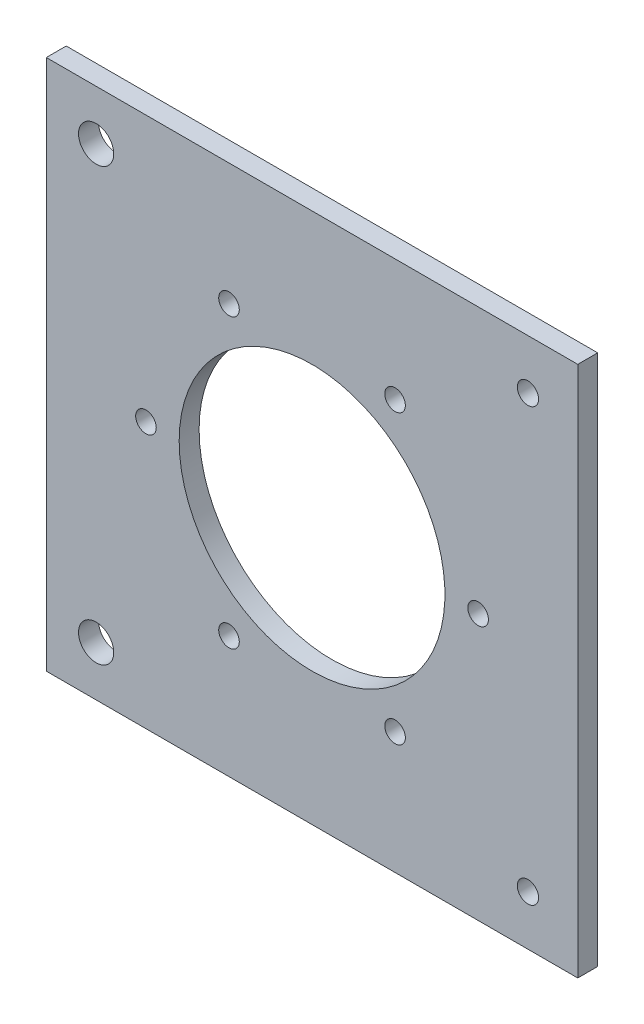
ISO-10303-21;
HEADER;
FILE_DESCRIPTION(('STEP AP214'),'2;1');
FILE_NAME('part.step','',(''),(''),'','','');
FILE_SCHEMA(('AUTOMOTIVE_DESIGN { 1 0 10303 214 1 1 1 1 }'));
ENDSEC;
DATA;
#1=APPLICATION_CONTEXT('core data for automotive mechanical design processes');
#2=APPLICATION_PROTOCOL_DEFINITION('international standard','automotive_design',2000,#1);
#3=PRODUCT_CONTEXT('',#1,'mechanical');
#4=PRODUCT('Part','Part','',(#3));
#5=PRODUCT_RELATED_PRODUCT_CATEGORY('part','',(#4));
#6=PRODUCT_DEFINITION_FORMATION('','',#4);
#7=PRODUCT_DEFINITION_CONTEXT('part definition',#1,'design');
#8=PRODUCT_DEFINITION('design','',#6,#7);
#9=PRODUCT_DEFINITION_SHAPE('','',#8);
#10=(LENGTH_UNIT() NAMED_UNIT(*) SI_UNIT(.MILLI.,.METRE.));
#11=(NAMED_UNIT(*) PLANE_ANGLE_UNIT() SI_UNIT($,.RADIAN.));
#12=(NAMED_UNIT(*) SI_UNIT($,.STERADIAN.) SOLID_ANGLE_UNIT());
#13=UNCERTAINTY_MEASURE_WITH_UNIT(LENGTH_MEASURE(1.E-05),#10,'distance_accuracy_value','');
#14=(GEOMETRIC_REPRESENTATION_CONTEXT(3) GLOBAL_UNCERTAINTY_ASSIGNED_CONTEXT((#13)) GLOBAL_UNIT_ASSIGNED_CONTEXT((#10,
#11,#12)) REPRESENTATION_CONTEXT('',''));
#15=CARTESIAN_POINT('',(0.,0.,0.));
#16=DIRECTION('',(0.,0.,1.));
#17=DIRECTION('',(1.,0.,0.));
#18=AXIS2_PLACEMENT_3D('',#15,#16,#17);
#19=CARTESIAN_POINT('',(0.,-40.,4.));
#20=DIRECTION('',(0.,1.,0.));
#21=DIRECTION('',(0.,0.,1.));
#22=AXIS2_PLACEMENT_3D('',#19,#20,#21);
#23=PLANE('',#22);
#24=DIRECTION('',(-1.,0.,0.));
#25=VECTOR('',#24,1.);
#26=CARTESIAN_POINT('',(0.,-40.,1.));
#27=LINE('',#26,#25);
#28=CARTESIAN_POINT('',(40.,-40.,1.));
#29=VERTEX_POINT('',#28);
#30=CARTESIAN_POINT('',(-40.,-40.,1.));
#31=VERTEX_POINT('',#30);
#32=EDGE_CURVE('E63',#29,#31,#27,.T.);
#33=ORIENTED_EDGE('',*,*,#32,.F.);
#34=DIRECTION('',(0.,0.,-1.));
#35=VECTOR('',#34,1.);
#36=CARTESIAN_POINT('',(40.,-40.,4.));
#37=LINE('',#36,#35);
#38=CARTESIAN_POINT('',(40.,-40.,4.));
#39=VERTEX_POINT('',#38);
#40=EDGE_CURVE('E11',#39,#29,#37,.T.);
#41=ORIENTED_EDGE('',*,*,#40,.F.);
#42=DIRECTION('',(1.,0.,0.));
#43=VECTOR('',#42,1.);
#44=CARTESIAN_POINT('',(0.,-40.,4.));
#45=LINE('',#44,#43);
#46=CARTESIAN_POINT('',(-40.,-40.,4.));
#47=VERTEX_POINT('',#46);
#48=EDGE_CURVE('E124',#47,#39,#45,.T.);
#49=ORIENTED_EDGE('',*,*,#48,.F.);
#50=DIRECTION('',(0.,0.,-1.));
#51=VECTOR('',#50,1.);
#52=CARTESIAN_POINT('',(-40.,-40.,4.));
#53=LINE('',#52,#51);
#54=EDGE_CURVE('E70',#47,#31,#53,.T.);
#55=ORIENTED_EDGE('',*,*,#54,.T.);
#56=EDGE_LOOP('',(#33,#41,#49,#55));
#57=FACE_BOUND('',#56,.T.);
#58=ADVANCED_FACE('F46',(#57),#23,.F.);
#59=CARTESIAN_POINT('',(40.,0.,4.));
#60=DIRECTION('',(-1.,0.,0.));
#61=DIRECTION('',(0.,0.,1.));
#62=AXIS2_PLACEMENT_3D('',#59,#60,#61);
#63=PLANE('',#62);
#64=DIRECTION('',(0.,-1.,0.));
#65=VECTOR('',#64,1.);
#66=CARTESIAN_POINT('',(40.,0.,1.));
#67=LINE('',#66,#65);
#68=CARTESIAN_POINT('',(40.,40.,1.));
#69=VERTEX_POINT('',#68);
#70=EDGE_CURVE('E104',#69,#29,#67,.T.);
#71=ORIENTED_EDGE('',*,*,#70,.F.);
#72=DIRECTION('',(0.,0.,-1.));
#73=VECTOR('',#72,1.);
#74=CARTESIAN_POINT('',(40.,40.,4.));
#75=LINE('',#74,#73);
#76=CARTESIAN_POINT('',(40.,40.,4.));
#77=VERTEX_POINT('',#76);
#78=EDGE_CURVE('E56',#77,#69,#75,.T.);
#79=ORIENTED_EDGE('',*,*,#78,.F.);
#80=DIRECTION('',(0.,1.,0.));
#81=VECTOR('',#80,1.);
#82=CARTESIAN_POINT('',(40.,0.,4.));
#83=LINE('',#82,#81);
#84=EDGE_CURVE('E121',#39,#77,#83,.T.);
#85=ORIENTED_EDGE('',*,*,#84,.F.);
#86=ORIENTED_EDGE('',*,*,#40,.T.);
#87=EDGE_LOOP('',(#71,#79,#85,#86));
#88=FACE_BOUND('',#87,.T.);
#89=ADVANCED_FACE('F240',(#88),#63,.F.);
#90=CARTESIAN_POINT('',(0.,40.,4.));
#91=DIRECTION('',(0.,1.,0.));
#92=DIRECTION('',(0.,0.,1.));
#93=AXIS2_PLACEMENT_3D('',#90,#91,#92);
#94=PLANE('',#93);
#95=ORIENTED_EDGE('',*,*,#78,.T.);
#96=DIRECTION('',(-1.,0.,0.));
#97=VECTOR('',#96,1.);
#98=CARTESIAN_POINT('',(0.,40.,1.));
#99=LINE('',#98,#97);
#100=CARTESIAN_POINT('',(-40.,40.,1.));
#101=VERTEX_POINT('',#100);
#102=EDGE_CURVE('E90',#69,#101,#99,.T.);
#103=ORIENTED_EDGE('',*,*,#102,.T.);
#104=DIRECTION('',(0.,0.,-1.));
#105=VECTOR('',#104,1.);
#106=CARTESIAN_POINT('',(-40.,40.,4.));
#107=LINE('',#106,#105);
#108=CARTESIAN_POINT('',(-40.,40.,4.));
#109=VERTEX_POINT('',#108);
#110=EDGE_CURVE('E100',#109,#101,#107,.T.);
#111=ORIENTED_EDGE('',*,*,#110,.F.);
#112=DIRECTION('',(1.,0.,0.));
#113=VECTOR('',#112,1.);
#114=CARTESIAN_POINT('',(0.,40.,4.));
#115=LINE('',#114,#113);
#116=EDGE_CURVE('E118',#109,#77,#115,.T.);
#117=ORIENTED_EDGE('',*,*,#116,.T.);
#118=EDGE_LOOP('',(#95,#103,#111,#117));
#119=FACE_BOUND('',#118,.T.);
#120=ADVANCED_FACE('F98',(#119),#94,.T.);
#121=CARTESIAN_POINT('',(-32.5,-32.5,4.));
#122=DIRECTION('',(0.,0.,-1.));
#123=DIRECTION('',(-1.,0.,0.));
#124=AXIS2_PLACEMENT_3D('',#121,#122,#123);
#125=CYLINDRICAL_SURFACE('',#124,2.65);
#126=CARTESIAN_POINT('',(-32.5,-32.5,4.));
#127=DIRECTION('',(0.,0.,1.));
#128=DIRECTION('',(1.,0.,0.));
#129=AXIS2_PLACEMENT_3D('',#126,#127,#128);
#130=CIRCLE('',#129,2.65);
#131=CARTESIAN_POINT('',(-29.85,-32.5,4.));
#132=VERTEX_POINT('',#131);
#133=EDGE_CURVE('E128',#132,#132,#130,.T.);
#134=ORIENTED_EDGE('',*,*,#133,.T.);
#135=EDGE_LOOP('',(#134));
#136=FACE_BOUND('',#135,.T.);
#137=CARTESIAN_POINT('',(-32.5,-32.5,1.));
#138=DIRECTION('',(0.,0.,-1.));
#139=DIRECTION('',(-1.,0.,0.));
#140=AXIS2_PLACEMENT_3D('',#137,#138,#139);
#141=CIRCLE('',#140,2.65);
#142=CARTESIAN_POINT('',(-35.15,-32.5,1.));
#143=VERTEX_POINT('',#142);
#144=EDGE_CURVE('E172',#143,#143,#141,.T.);
#145=ORIENTED_EDGE('',*,*,#144,.T.);
#146=EDGE_LOOP('',(#145));
#147=FACE_BOUND('',#146,.T.);
#148=ADVANCED_FACE('F250',(#136,#147),#125,.F.);
#149=CARTESIAN_POINT('',(-32.5,32.5,4.));
#150=DIRECTION('',(0.,0.,-1.));
#151=DIRECTION('',(-1.,0.,0.));
#152=AXIS2_PLACEMENT_3D('',#149,#150,#151);
#153=CYLINDRICAL_SURFACE('',#152,2.65);
#154=CARTESIAN_POINT('',(-32.5,32.5,4.));
#155=DIRECTION('',(0.,0.,1.));
#156=DIRECTION('',(1.,0.,0.));
#157=AXIS2_PLACEMENT_3D('',#154,#155,#156);
#158=CIRCLE('',#157,2.65);
#159=CARTESIAN_POINT('',(-29.85,32.5,4.));
#160=VERTEX_POINT('',#159);
#161=EDGE_CURVE('E132',#160,#160,#158,.T.);
#162=ORIENTED_EDGE('',*,*,#161,.T.);
#163=EDGE_LOOP('',(#162));
#164=FACE_BOUND('',#163,.T.);
#165=CARTESIAN_POINT('',(-32.5,32.5,1.));
#166=DIRECTION('',(0.,0.,-1.));
#167=DIRECTION('',(-1.,0.,0.));
#168=AXIS2_PLACEMENT_3D('',#165,#166,#167);
#169=CIRCLE('',#168,2.65);
#170=CARTESIAN_POINT('',(-35.15,32.5,1.));
#171=VERTEX_POINT('',#170);
#172=EDGE_CURVE('E176',#171,#171,#169,.T.);
#173=ORIENTED_EDGE('',*,*,#172,.T.);
#174=EDGE_LOOP('',(#173));
#175=FACE_BOUND('',#174,.T.);
#176=ADVANCED_FACE('F253',(#164,#175),#153,.F.);
#177=CARTESIAN_POINT('',(32.5,-32.5,4.));
#178=DIRECTION('',(0.,0.,-1.));
#179=DIRECTION('',(-1.,0.,0.));
#180=AXIS2_PLACEMENT_3D('',#177,#178,#179);
#181=CYLINDRICAL_SURFACE('',#180,1.6);
#182=CARTESIAN_POINT('',(32.5,-32.5,4.));
#183=DIRECTION('',(0.,0.,1.));
#184=DIRECTION('',(1.,0.,0.));
#185=AXIS2_PLACEMENT_3D('',#182,#183,#184);
#186=CIRCLE('',#185,1.6);
#187=CARTESIAN_POINT('',(34.1,-32.5,4.));
#188=VERTEX_POINT('',#187);
#189=EDGE_CURVE('E136',#188,#188,#186,.T.);
#190=ORIENTED_EDGE('',*,*,#189,.T.);
#191=EDGE_LOOP('',(#190));
#192=FACE_BOUND('',#191,.T.);
#193=CARTESIAN_POINT('',(32.5,-32.5,1.));
#194=DIRECTION('',(0.,0.,-1.));
#195=DIRECTION('',(-1.,0.,0.));
#196=AXIS2_PLACEMENT_3D('',#193,#194,#195);
#197=CIRCLE('',#196,1.6);
#198=CARTESIAN_POINT('',(30.9,-32.5,1.));
#199=VERTEX_POINT('',#198);
#200=EDGE_CURVE('E180',#199,#199,#197,.T.);
#201=ORIENTED_EDGE('',*,*,#200,.T.);
#202=EDGE_LOOP('',(#201));
#203=FACE_BOUND('',#202,.T.);
#204=ADVANCED_FACE('F256',(#192,#203),#181,.F.);
#205=CARTESIAN_POINT('',(32.5,32.5,4.));
#206=DIRECTION('',(0.,0.,-1.));
#207=DIRECTION('',(-1.,0.,0.));
#208=AXIS2_PLACEMENT_3D('',#205,#206,#207);
#209=CYLINDRICAL_SURFACE('',#208,1.6);
#210=CARTESIAN_POINT('',(32.5,32.5,4.));
#211=DIRECTION('',(0.,0.,1.));
#212=DIRECTION('',(1.,0.,0.));
#213=AXIS2_PLACEMENT_3D('',#210,#211,#212);
#214=CIRCLE('',#213,1.6);
#215=CARTESIAN_POINT('',(34.1,32.5,4.));
#216=VERTEX_POINT('',#215);
#217=EDGE_CURVE('E140',#216,#216,#214,.T.);
#218=ORIENTED_EDGE('',*,*,#217,.T.);
#219=EDGE_LOOP('',(#218));
#220=FACE_BOUND('',#219,.T.);
#221=CARTESIAN_POINT('',(32.5,32.5,1.));
#222=DIRECTION('',(0.,0.,-1.));
#223=DIRECTION('',(-1.,0.,0.));
#224=AXIS2_PLACEMENT_3D('',#221,#222,#223);
#225=CIRCLE('',#224,1.6);
#226=CARTESIAN_POINT('',(30.9,32.5,1.));
#227=VERTEX_POINT('',#226);
#228=EDGE_CURVE('E184',#227,#227,#225,.T.);
#229=ORIENTED_EDGE('',*,*,#228,.T.);
#230=EDGE_LOOP('',(#229));
#231=FACE_BOUND('',#230,.T.);
#232=ADVANCED_FACE('F48',(#220,#231),#209,.F.);
#233=CARTESIAN_POINT('',(-40.,0.,4.));
#234=DIRECTION('',(-1.,0.,0.));
#235=DIRECTION('',(0.,0.,1.));
#236=AXIS2_PLACEMENT_3D('',#233,#234,#235);
#237=PLANE('',#236);
#238=ORIENTED_EDGE('',*,*,#110,.T.);
#239=DIRECTION('',(0.,-1.,0.));
#240=VECTOR('',#239,1.);
#241=CARTESIAN_POINT('',(-40.,0.,1.));
#242=LINE('',#241,#240);
#243=EDGE_CURVE('E87',#101,#31,#242,.T.);
#244=ORIENTED_EDGE('',*,*,#243,.T.);
#245=ORIENTED_EDGE('',*,*,#54,.F.);
#246=DIRECTION('',(0.,1.,0.));
#247=VECTOR('',#246,1.);
#248=CARTESIAN_POINT('',(-40.,0.,4.));
#249=LINE('',#248,#247);
#250=EDGE_CURVE('E108',#47,#109,#249,.T.);
#251=ORIENTED_EDGE('',*,*,#250,.T.);
#252=EDGE_LOOP('',(#238,#244,#245,#251));
#253=FACE_BOUND('',#252,.T.);
#254=ADVANCED_FACE('F106',(#253),#237,.T.);
#255=CARTESIAN_POINT('',(-12.5000000000003,-21.6506350946108,0.));
#256=DIRECTION('',(0.,0.,1.));
#257=DIRECTION('',(1.,0.,0.));
#258=AXIS2_PLACEMENT_3D('',#255,#256,#257);
#259=CYLINDRICAL_SURFACE('',#258,1.55);
#260=CARTESIAN_POINT('',(-12.5000000000003,-21.6506350946108,4.));
#261=DIRECTION('',(0.,0.,1.));
#262=DIRECTION('',(1.,0.,0.));
#263=AXIS2_PLACEMENT_3D('',#260,#261,#262);
#264=CIRCLE('',#263,1.55);
#265=CARTESIAN_POINT('',(-10.9500000000003,-21.6506350946108,4.));
#266=VERTEX_POINT('',#265);
#267=EDGE_CURVE('E158',#266,#266,#264,.T.);
#268=ORIENTED_EDGE('',*,*,#267,.T.);
#269=EDGE_LOOP('',(#268));
#270=FACE_BOUND('',#269,.T.);
#271=CARTESIAN_POINT('',(-12.5000000000003,-21.6506350946108,1.));
#272=DIRECTION('',(0.,0.,-1.));
#273=DIRECTION('',(-1.,0.,0.));
#274=AXIS2_PLACEMENT_3D('',#271,#272,#273);
#275=CIRCLE('',#274,1.55);
#276=CARTESIAN_POINT('',(-14.0500000000003,-21.6506350946108,1.));
#277=VERTEX_POINT('',#276);
#278=EDGE_CURVE('E94',#277,#277,#275,.F.);
#279=ORIENTED_EDGE('',*,*,#278,.F.);
#280=EDGE_LOOP('',(#279));
#281=FACE_BOUND('',#280,.T.);
#282=ADVANCED_FACE('F293',(#270,#281),#259,.F.);
#283=CARTESIAN_POINT('',(-12.4999999999999,21.650635094611,0.));
#284=DIRECTION('',(0.,0.,1.));
#285=DIRECTION('',(1.,0.,0.));
#286=AXIS2_PLACEMENT_3D('',#283,#284,#285);
#287=CYLINDRICAL_SURFACE('',#286,1.55);
#288=CARTESIAN_POINT('',(-12.4999999999999,21.650635094611,4.));
#289=DIRECTION('',(0.,0.,1.));
#290=DIRECTION('',(1.,0.,0.));
#291=AXIS2_PLACEMENT_3D('',#288,#289,#290);
#292=CIRCLE('',#291,1.55);
#293=CARTESIAN_POINT('',(-10.9499999999999,21.650635094611,4.));
#294=VERTEX_POINT('',#293);
#295=EDGE_CURVE('E154',#294,#294,#292,.T.);
#296=ORIENTED_EDGE('',*,*,#295,.T.);
#297=EDGE_LOOP('',(#296));
#298=FACE_BOUND('',#297,.T.);
#299=CARTESIAN_POINT('',(-12.4999999999999,21.650635094611,1.));
#300=DIRECTION('',(0.,0.,-1.));
#301=DIRECTION('',(-1.,0.,0.));
#302=AXIS2_PLACEMENT_3D('',#299,#300,#301);
#303=CIRCLE('',#302,1.55);
#304=CARTESIAN_POINT('',(-14.0499999999999,21.650635094611,1.));
#305=VERTEX_POINT('',#304);
#306=EDGE_CURVE('E195',#305,#305,#303,.F.);
#307=ORIENTED_EDGE('',*,*,#306,.F.);
#308=EDGE_LOOP('',(#307));
#309=FACE_BOUND('',#308,.T.);
#310=ADVANCED_FACE('F296',(#298,#309),#287,.F.);
#311=CARTESIAN_POINT('',(12.5000000000002,21.6506350946109,0.));
#312=DIRECTION('',(0.,0.,1.));
#313=DIRECTION('',(1.,0.,0.));
#314=AXIS2_PLACEMENT_3D('',#311,#312,#313);
#315=CYLINDRICAL_SURFACE('',#314,1.55);
#316=CARTESIAN_POINT('',(12.5000000000002,21.6506350946109,4.));
#317=DIRECTION('',(0.,0.,1.));
#318=DIRECTION('',(1.,0.,0.));
#319=AXIS2_PLACEMENT_3D('',#316,#317,#318);
#320=CIRCLE('',#319,1.55);
#321=CARTESIAN_POINT('',(14.0500000000002,21.6506350946109,4.));
#322=VERTEX_POINT('',#321);
#323=EDGE_CURVE('E149',#322,#322,#320,.T.);
#324=ORIENTED_EDGE('',*,*,#323,.T.);
#325=EDGE_LOOP('',(#324));
#326=FACE_BOUND('',#325,.T.);
#327=CARTESIAN_POINT('',(12.5000000000002,21.6506350946109,1.));
#328=DIRECTION('',(0.,0.,-1.));
#329=DIRECTION('',(-1.,0.,0.));
#330=AXIS2_PLACEMENT_3D('',#327,#328,#329);
#331=CIRCLE('',#330,1.55);
#332=CARTESIAN_POINT('',(10.9500000000002,21.6506350946109,1.));
#333=VERTEX_POINT('',#332);
#334=EDGE_CURVE('E199',#333,#333,#331,.F.);
#335=ORIENTED_EDGE('',*,*,#334,.F.);
#336=EDGE_LOOP('',(#335));
#337=FACE_BOUND('',#336,.T.);
#338=ADVANCED_FACE('F289',(#326,#337),#315,.F.);
#339=CARTESIAN_POINT('',(25.,-2.68882138776405E-13,0.));
#340=DIRECTION('',(0.,0.,1.));
#341=DIRECTION('',(1.,0.,0.));
#342=AXIS2_PLACEMENT_3D('',#339,#340,#341);
#343=CYLINDRICAL_SURFACE('',#342,1.55);
#344=CARTESIAN_POINT('',(25.,-2.68882138776405E-13,4.));
#345=DIRECTION('',(0.,0.,1.));
#346=DIRECTION('',(1.,0.,0.));
#347=AXIS2_PLACEMENT_3D('',#344,#345,#346);
#348=CIRCLE('',#347,1.55);
#349=CARTESIAN_POINT('',(26.55,-2.68882138776405E-13,4.));
#350=VERTEX_POINT('',#349);
#351=EDGE_CURVE('E145',#350,#350,#348,.T.);
#352=ORIENTED_EDGE('',*,*,#351,.T.);
#353=EDGE_LOOP('',(#352));
#354=FACE_BOUND('',#353,.T.);
#355=CARTESIAN_POINT('',(25.,-2.68882138776405E-13,1.));
#356=DIRECTION('',(0.,0.,-1.));
#357=DIRECTION('',(-1.,0.,0.));
#358=AXIS2_PLACEMENT_3D('',#355,#356,#357);
#359=CIRCLE('',#358,1.55);
#360=CARTESIAN_POINT('',(23.45,-2.68882138776405E-13,1.));
#361=VERTEX_POINT('',#360);
#362=EDGE_CURVE('E203',#361,#361,#359,.F.);
#363=ORIENTED_EDGE('',*,*,#362,.F.);
#364=EDGE_LOOP('',(#363));
#365=FACE_BOUND('',#364,.T.);
#366=ADVANCED_FACE('F283',(#354,#365),#343,.F.);
#367=CARTESIAN_POINT('',(12.4999999999997,-21.6506350946111,0.));
#368=DIRECTION('',(0.,0.,1.));
#369=DIRECTION('',(1.,0.,0.));
#370=AXIS2_PLACEMENT_3D('',#367,#368,#369);
#371=CYLINDRICAL_SURFACE('',#370,1.55);
#372=CARTESIAN_POINT('',(12.4999999999997,-21.6506350946111,4.));
#373=DIRECTION('',(0.,0.,1.));
#374=DIRECTION('',(1.,0.,0.));
#375=AXIS2_PLACEMENT_3D('',#372,#373,#374);
#376=CIRCLE('',#375,1.55);
#377=CARTESIAN_POINT('',(14.0499999999997,-21.6506350946111,4.));
#378=VERTEX_POINT('',#377);
#379=EDGE_CURVE('E150',#378,#378,#376,.T.);
#380=ORIENTED_EDGE('',*,*,#379,.T.);
#381=EDGE_LOOP('',(#380));
#382=FACE_BOUND('',#381,.T.);
#383=CARTESIAN_POINT('',(12.4999999999997,-21.6506350946111,1.));
#384=DIRECTION('',(0.,0.,-1.));
#385=DIRECTION('',(-1.,0.,0.));
#386=AXIS2_PLACEMENT_3D('',#383,#384,#385);
#387=CIRCLE('',#386,1.55);
#388=CARTESIAN_POINT('',(10.9499999999997,-21.6506350946111,1.));
#389=VERTEX_POINT('',#388);
#390=EDGE_CURVE('E207',#389,#389,#387,.F.);
#391=ORIENTED_EDGE('',*,*,#390,.F.);
#392=EDGE_LOOP('',(#391));
#393=FACE_BOUND('',#392,.T.);
#394=ADVANCED_FACE('F234',(#382,#393),#371,.F.);
#395=CARTESIAN_POINT('',(-25.,4.42354486374086E-13,0.));
#396=DIRECTION('',(0.,0.,1.));
#397=DIRECTION('',(1.,0.,0.));
#398=AXIS2_PLACEMENT_3D('',#395,#396,#397);
#399=CYLINDRICAL_SURFACE('',#398,1.55);
#400=CARTESIAN_POINT('',(-25.,4.42354486374086E-13,4.));
#401=DIRECTION('',(0.,0.,1.));
#402=DIRECTION('',(1.,0.,0.));
#403=AXIS2_PLACEMENT_3D('',#400,#401,#402);
#404=CIRCLE('',#403,1.55);
#405=CARTESIAN_POINT('',(-23.45,4.42354486374086E-13,4.));
#406=VERTEX_POINT('',#405);
#407=EDGE_CURVE('E144',#406,#406,#404,.T.);
#408=ORIENTED_EDGE('',*,*,#407,.T.);
#409=EDGE_LOOP('',(#408));
#410=FACE_BOUND('',#409,.T.);
#411=CARTESIAN_POINT('',(-25.,4.42354486374086E-13,1.));
#412=DIRECTION('',(0.,0.,-1.));
#413=DIRECTION('',(-1.,0.,0.));
#414=AXIS2_PLACEMENT_3D('',#411,#412,#413);
#415=CIRCLE('',#414,1.55);
#416=CARTESIAN_POINT('',(-26.55,4.42354486374086E-13,1.));
#417=VERTEX_POINT('',#416);
#418=EDGE_CURVE('E211',#417,#417,#415,.F.);
#419=ORIENTED_EDGE('',*,*,#418,.F.);
#420=EDGE_LOOP('',(#419));
#421=FACE_BOUND('',#420,.T.);
#422=ADVANCED_FACE('F224',(#410,#421),#399,.F.);
#423=CARTESIAN_POINT('',(0.,0.,4.));
#424=DIRECTION('',(0.,0.,-1.));
#425=DIRECTION('',(-1.,0.,0.));
#426=AXIS2_PLACEMENT_3D('',#423,#424,#425);
#427=CYLINDRICAL_SURFACE('',#426,20.);
#428=CARTESIAN_POINT('',(0.,0.,4.));
#429=DIRECTION('',(0.,0.,-1.));
#430=DIRECTION('',(-1.,0.,0.));
#431=AXIS2_PLACEMENT_3D('',#428,#429,#430);
#432=CIRCLE('',#431,20.);
#433=CARTESIAN_POINT('',(-20.,0.,4.));
#434=VERTEX_POINT('',#433);
#435=EDGE_CURVE('E165',#434,#434,#432,.T.);
#436=ORIENTED_EDGE('',*,*,#435,.F.);
#437=EDGE_LOOP('',(#436));
#438=FACE_BOUND('',#437,.T.);
#439=CARTESIAN_POINT('',(0.,0.,1.));
#440=DIRECTION('',(0.,0.,-1.));
#441=DIRECTION('',(-1.,0.,0.));
#442=AXIS2_PLACEMENT_3D('',#439,#440,#441);
#443=CIRCLE('',#442,20.);
#444=CARTESIAN_POINT('',(-20.,0.,1.));
#445=VERTEX_POINT('',#444);
#446=EDGE_CURVE('E50',#445,#445,#443,.F.);
#447=ORIENTED_EDGE('',*,*,#446,.F.);
#448=EDGE_LOOP('',(#447));
#449=FACE_BOUND('',#448,.T.);
#450=ADVANCED_FACE('F221',(#438,#449),#427,.F.);
#451=CARTESIAN_POINT('',(0.,0.,4.));
#452=DIRECTION('',(0.,0.,1.));
#453=DIRECTION('',(1.,0.,0.));
#454=AXIS2_PLACEMENT_3D('',#451,#452,#453);
#455=PLANE('',#454);
#456=ORIENTED_EDGE('',*,*,#435,.T.);
#457=EDGE_LOOP('',(#456));
#458=FACE_BOUND('',#457,.T.);
#459=ORIENTED_EDGE('',*,*,#407,.F.);
#460=EDGE_LOOP('',(#459));
#461=FACE_BOUND('',#460,.T.);
#462=ORIENTED_EDGE('',*,*,#379,.F.);
#463=EDGE_LOOP('',(#462));
#464=FACE_BOUND('',#463,.T.);
#465=ORIENTED_EDGE('',*,*,#351,.F.);
#466=EDGE_LOOP('',(#465));
#467=FACE_BOUND('',#466,.T.);
#468=ORIENTED_EDGE('',*,*,#323,.F.);
#469=EDGE_LOOP('',(#468));
#470=FACE_BOUND('',#469,.T.);
#471=ORIENTED_EDGE('',*,*,#295,.F.);
#472=EDGE_LOOP('',(#471));
#473=FACE_BOUND('',#472,.T.);
#474=ORIENTED_EDGE('',*,*,#267,.F.);
#475=EDGE_LOOP('',(#474));
#476=FACE_BOUND('',#475,.T.);
#477=ORIENTED_EDGE('',*,*,#217,.F.);
#478=EDGE_LOOP('',(#477));
#479=FACE_BOUND('',#478,.T.);
#480=ORIENTED_EDGE('',*,*,#189,.F.);
#481=EDGE_LOOP('',(#480));
#482=FACE_BOUND('',#481,.T.);
#483=ORIENTED_EDGE('',*,*,#161,.F.);
#484=EDGE_LOOP('',(#483));
#485=FACE_BOUND('',#484,.T.);
#486=ORIENTED_EDGE('',*,*,#133,.F.);
#487=EDGE_LOOP('',(#486));
#488=FACE_BOUND('',#487,.T.);
#489=ORIENTED_EDGE('',*,*,#48,.T.);
#490=ORIENTED_EDGE('',*,*,#84,.T.);
#491=ORIENTED_EDGE('',*,*,#116,.F.);
#492=ORIENTED_EDGE('',*,*,#250,.F.);
#493=EDGE_LOOP('',(#489,#490,#491,#492));
#494=FACE_BOUND('',#493,.T.);
#495=ADVANCED_FACE('F223',(#458,#461,#464,#467,#470,#473,#476,#479,#482,#485,#488,#494),#455,.T.);
#496=CARTESIAN_POINT('',(0.,0.,1.));
#497=DIRECTION('',(0.,0.,-1.));
#498=DIRECTION('',(-1.,0.,0.));
#499=AXIS2_PLACEMENT_3D('',#496,#497,#498);
#500=PLANE('',#499);
#501=ORIENTED_EDGE('',*,*,#144,.F.);
#502=EDGE_LOOP('',(#501));
#503=FACE_BOUND('',#502,.T.);
#504=ORIENTED_EDGE('',*,*,#172,.F.);
#505=EDGE_LOOP('',(#504));
#506=FACE_BOUND('',#505,.T.);
#507=ORIENTED_EDGE('',*,*,#200,.F.);
#508=EDGE_LOOP('',(#507));
#509=FACE_BOUND('',#508,.T.);
#510=ORIENTED_EDGE('',*,*,#228,.F.);
#511=EDGE_LOOP('',(#510));
#512=FACE_BOUND('',#511,.T.);
#513=ORIENTED_EDGE('',*,*,#278,.T.);
#514=EDGE_LOOP('',(#513));
#515=FACE_BOUND('',#514,.T.);
#516=ORIENTED_EDGE('',*,*,#306,.T.);
#517=EDGE_LOOP('',(#516));
#518=FACE_BOUND('',#517,.T.);
#519=ORIENTED_EDGE('',*,*,#334,.T.);
#520=EDGE_LOOP('',(#519));
#521=FACE_BOUND('',#520,.T.);
#522=ORIENTED_EDGE('',*,*,#362,.T.);
#523=EDGE_LOOP('',(#522));
#524=FACE_BOUND('',#523,.T.);
#525=ORIENTED_EDGE('',*,*,#390,.T.);
#526=EDGE_LOOP('',(#525));
#527=FACE_BOUND('',#526,.T.);
#528=ORIENTED_EDGE('',*,*,#418,.T.);
#529=EDGE_LOOP('',(#528));
#530=FACE_BOUND('',#529,.T.);
#531=ORIENTED_EDGE('',*,*,#446,.T.);
#532=EDGE_LOOP('',(#531));
#533=FACE_BOUND('',#532,.T.);
#534=ORIENTED_EDGE('',*,*,#32,.T.);
#535=ORIENTED_EDGE('',*,*,#243,.F.);
#536=ORIENTED_EDGE('',*,*,#102,.F.);
#537=ORIENTED_EDGE('',*,*,#70,.T.);
#538=EDGE_LOOP('',(#534,#535,#536,#537));
#539=FACE_BOUND('',#538,.T.);
#540=ADVANCED_FACE('F89',(#503,#506,#509,#512,#515,#518,#521,#524,#527,#530,#533,#539),#500,.T.);
#541=CLOSED_SHELL('',(#58,#89,#120,#148,#176,#204,#232,#254,#282,#310,#338,#366,#394,#422,#450,
#495,#540));
#542=MANIFOLD_SOLID_BREP('B2',#541);
#543=ADVANCED_BREP_SHAPE_REPRESENTATION('',(#18,#542),#14);
#544=SHAPE_DEFINITION_REPRESENTATION(#9,#543);
ENDSEC;
END-ISO-10303-21;
